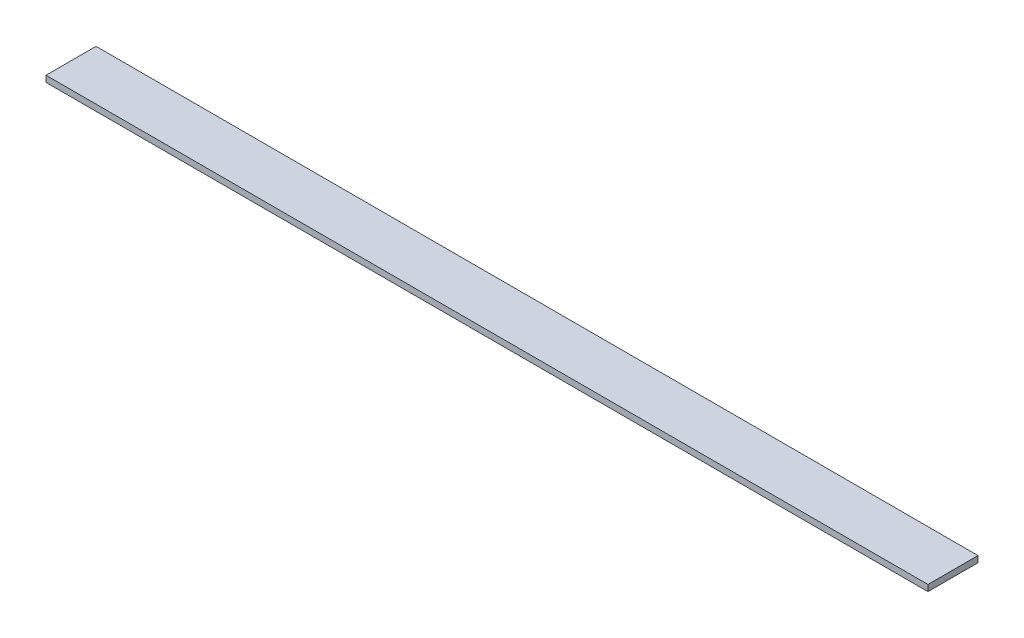
ISO-10303-21;
HEADER;
FILE_DESCRIPTION(('STEP AP214'),'2;1');
FILE_NAME('part.step','',(''),(''),'','','');
FILE_SCHEMA(('AUTOMOTIVE_DESIGN { 1 0 10303 214 1 1 1 1 }'));
ENDSEC;
DATA;
#1=APPLICATION_CONTEXT('core data for automotive mechanical design processes');
#2=APPLICATION_PROTOCOL_DEFINITION('international standard','automotive_design',2000,#1);
#3=PRODUCT_CONTEXT('',#1,'mechanical');
#4=PRODUCT('Part','Part','',(#3));
#5=PRODUCT_RELATED_PRODUCT_CATEGORY('part','',(#4));
#6=PRODUCT_DEFINITION_FORMATION('','',#4);
#7=PRODUCT_DEFINITION_CONTEXT('part definition',#1,'design');
#8=PRODUCT_DEFINITION('design','',#6,#7);
#9=PRODUCT_DEFINITION_SHAPE('','',#8);
#10=(LENGTH_UNIT() NAMED_UNIT(*) SI_UNIT(.MILLI.,.METRE.));
#11=(NAMED_UNIT(*) PLANE_ANGLE_UNIT() SI_UNIT($,.RADIAN.));
#12=(NAMED_UNIT(*) SI_UNIT($,.STERADIAN.) SOLID_ANGLE_UNIT());
#13=UNCERTAINTY_MEASURE_WITH_UNIT(LENGTH_MEASURE(1.E-05),#10,'distance_accuracy_value','');
#14=(GEOMETRIC_REPRESENTATION_CONTEXT(3) GLOBAL_UNCERTAINTY_ASSIGNED_CONTEXT((#13)) GLOBAL_UNIT_ASSIGNED_CONTEXT((#10,
#11,#12)) REPRESENTATION_CONTEXT('',''));
#15=CARTESIAN_POINT('',(0.,0.,0.));
#16=DIRECTION('',(0.,0.,1.));
#17=DIRECTION('',(1.,0.,0.));
#18=AXIS2_PLACEMENT_3D('',#15,#16,#17);
#19=CARTESIAN_POINT('',(223.8248,-3.175,12.7));
#20=DIRECTION('',(1.,0.,0.));
#21=DIRECTION('',(0.,0.,-1.));
#22=AXIS2_PLACEMENT_3D('',#19,#20,#21);
#23=PLANE('',#22);
#24=DIRECTION('',(0.,0.,-1.));
#25=VECTOR('',#24,1.);
#26=CARTESIAN_POINT('',(223.8248,0.,12.7));
#27=LINE('',#26,#25);
#28=CARTESIAN_POINT('',(223.8248,0.,12.7));
#29=VERTEX_POINT('',#28);
#30=CARTESIAN_POINT('',(223.8248,0.,-12.7));
#31=VERTEX_POINT('',#30);
#32=EDGE_CURVE('E104',#29,#31,#27,.T.);
#33=ORIENTED_EDGE('',*,*,#32,.F.);
#34=DIRECTION('',(0.,1.,0.));
#35=VECTOR('',#34,1.);
#36=CARTESIAN_POINT('',(223.8248,-3.175,12.7));
#37=LINE('',#36,#35);
#38=CARTESIAN_POINT('',(223.8248,-3.175,12.7));
#39=VERTEX_POINT('',#38);
#40=EDGE_CURVE('E11',#39,#29,#37,.T.);
#41=ORIENTED_EDGE('',*,*,#40,.F.);
#42=DIRECTION('',(0.,0.,-1.));
#43=VECTOR('',#42,1.);
#44=CARTESIAN_POINT('',(223.8248,-3.175,12.7));
#45=LINE('',#44,#43);
#46=CARTESIAN_POINT('',(223.8248,-3.175,-12.7));
#47=VERTEX_POINT('',#46);
#48=EDGE_CURVE('E98',#39,#47,#45,.T.);
#49=ORIENTED_EDGE('',*,*,#48,.T.);
#50=DIRECTION('',(0.,1.,0.));
#51=VECTOR('',#50,1.);
#52=CARTESIAN_POINT('',(223.8248,-3.175,-12.7));
#53=LINE('',#52,#51);
#54=EDGE_CURVE('E43',#47,#31,#53,.T.);
#55=ORIENTED_EDGE('',*,*,#54,.T.);
#56=EDGE_LOOP('',(#33,#41,#49,#55));
#57=FACE_BOUND('',#56,.T.);
#58=ADVANCED_FACE('F40',(#57),#23,.T.);
#59=CARTESIAN_POINT('',(-223.8248,-3.175,12.7));
#60=DIRECTION('',(0.,0.,1.));
#61=DIRECTION('',(1.,0.,0.));
#62=AXIS2_PLACEMENT_3D('',#59,#60,#61);
#63=PLANE('',#62);
#64=DIRECTION('',(1.,0.,0.));
#65=VECTOR('',#64,1.);
#66=CARTESIAN_POINT('',(-223.8248,0.,12.7));
#67=LINE('',#66,#65);
#68=CARTESIAN_POINT('',(-223.8248,0.,12.7));
#69=VERTEX_POINT('',#68);
#70=EDGE_CURVE('E100',#69,#29,#67,.T.);
#71=ORIENTED_EDGE('',*,*,#70,.F.);
#72=DIRECTION('',(0.,1.,0.));
#73=VECTOR('',#72,1.);
#74=CARTESIAN_POINT('',(-223.8248,-3.175,12.7));
#75=LINE('',#74,#73);
#76=CARTESIAN_POINT('',(-223.8248,-3.175,12.7));
#77=VERTEX_POINT('',#76);
#78=EDGE_CURVE('E49',#77,#69,#75,.T.);
#79=ORIENTED_EDGE('',*,*,#78,.F.);
#80=DIRECTION('',(1.,0.,0.));
#81=VECTOR('',#80,1.);
#82=CARTESIAN_POINT('',(-223.8248,-3.175,12.7));
#83=LINE('',#82,#81);
#84=EDGE_CURVE('E95',#77,#39,#83,.T.);
#85=ORIENTED_EDGE('',*,*,#84,.T.);
#86=ORIENTED_EDGE('',*,*,#40,.T.);
#87=EDGE_LOOP('',(#71,#79,#85,#86));
#88=FACE_BOUND('',#87,.T.);
#89=ADVANCED_FACE('F114',(#88),#63,.T.);
#90=CARTESIAN_POINT('',(-223.8248,-3.175,12.7));
#91=DIRECTION('',(-1.,0.,0.));
#92=DIRECTION('',(0.,0.,1.));
#93=AXIS2_PLACEMENT_3D('',#90,#91,#92);
#94=PLANE('',#93);
#95=DIRECTION('',(0.,0.,1.));
#96=VECTOR('',#95,1.);
#97=CARTESIAN_POINT('',(-223.8248,0.,12.7));
#98=LINE('',#97,#96);
#99=CARTESIAN_POINT('',(-223.8248,0.,-12.7));
#100=VERTEX_POINT('',#99);
#101=EDGE_CURVE('E90',#100,#69,#98,.T.);
#102=ORIENTED_EDGE('',*,*,#101,.F.);
#103=DIRECTION('',(0.,1.,0.));
#104=VECTOR('',#103,1.);
#105=CARTESIAN_POINT('',(-223.8248,-3.175,-12.7));
#106=LINE('',#105,#104);
#107=CARTESIAN_POINT('',(-223.8248,-3.175,-12.7));
#108=VERTEX_POINT('',#107);
#109=EDGE_CURVE('E85',#108,#100,#106,.T.);
#110=ORIENTED_EDGE('',*,*,#109,.F.);
#111=DIRECTION('',(0.,0.,1.));
#112=VECTOR('',#111,1.);
#113=CARTESIAN_POINT('',(-223.8248,-3.175,12.7));
#114=LINE('',#113,#112);
#115=EDGE_CURVE('E88',#108,#77,#114,.T.);
#116=ORIENTED_EDGE('',*,*,#115,.T.);
#117=ORIENTED_EDGE('',*,*,#78,.T.);
#118=EDGE_LOOP('',(#102,#110,#116,#117));
#119=FACE_BOUND('',#118,.T.);
#120=ADVANCED_FACE('F87',(#119),#94,.T.);
#121=CARTESIAN_POINT('',(-223.8248,-3.175,-12.7));
#122=DIRECTION('',(0.,0.,-1.));
#123=DIRECTION('',(-1.,0.,0.));
#124=AXIS2_PLACEMENT_3D('',#121,#122,#123);
#125=PLANE('',#124);
#126=DIRECTION('',(-1.,0.,0.));
#127=VECTOR('',#126,1.);
#128=CARTESIAN_POINT('',(-223.8248,0.,-12.7));
#129=LINE('',#128,#127);
#130=EDGE_CURVE('E107',#31,#100,#129,.T.);
#131=ORIENTED_EDGE('',*,*,#130,.F.);
#132=ORIENTED_EDGE('',*,*,#54,.F.);
#133=DIRECTION('',(-1.,0.,0.));
#134=VECTOR('',#133,1.);
#135=CARTESIAN_POINT('',(-223.8248,-3.175,-12.7));
#136=LINE('',#135,#134);
#137=EDGE_CURVE('E94',#47,#108,#136,.T.);
#138=ORIENTED_EDGE('',*,*,#137,.T.);
#139=ORIENTED_EDGE('',*,*,#109,.T.);
#140=EDGE_LOOP('',(#131,#132,#138,#139));
#141=FACE_BOUND('',#140,.T.);
#142=ADVANCED_FACE('F97',(#141),#125,.T.);
#143=CARTESIAN_POINT('',(0.,-3.175,0.));
#144=DIRECTION('',(0.,-1.,0.));
#145=DIRECTION('',(0.,0.,-1.));
#146=AXIS2_PLACEMENT_3D('',#143,#144,#145);
#147=PLANE('',#146);
#148=ORIENTED_EDGE('',*,*,#48,.F.);
#149=ORIENTED_EDGE('',*,*,#84,.F.);
#150=ORIENTED_EDGE('',*,*,#115,.F.);
#151=ORIENTED_EDGE('',*,*,#137,.F.);
#152=EDGE_LOOP('',(#148,#149,#150,#151));
#153=FACE_BOUND('',#152,.T.);
#154=ADVANCED_FACE('F93',(#153),#147,.T.);
#155=CARTESIAN_POINT('',(0.,0.,0.));
#156=DIRECTION('',(0.,-1.,0.));
#157=DIRECTION('',(0.,0.,-1.));
#158=AXIS2_PLACEMENT_3D('',#155,#156,#157);
#159=PLANE('',#158);
#160=ORIENTED_EDGE('',*,*,#32,.T.);
#161=ORIENTED_EDGE('',*,*,#130,.T.);
#162=ORIENTED_EDGE('',*,*,#101,.T.);
#163=ORIENTED_EDGE('',*,*,#70,.T.);
#164=EDGE_LOOP('',(#160,#161,#162,#163));
#165=FACE_BOUND('',#164,.T.);
#166=ADVANCED_FACE('F113',(#165),#159,.F.);
#167=CLOSED_SHELL('',(#58,#89,#120,#142,#154,#166));
#168=MANIFOLD_SOLID_BREP('B2',#167);
#169=ADVANCED_BREP_SHAPE_REPRESENTATION('',(#18,#168),#14);
#170=SHAPE_DEFINITION_REPRESENTATION(#9,#169);
ENDSEC;
END-ISO-10303-21;
